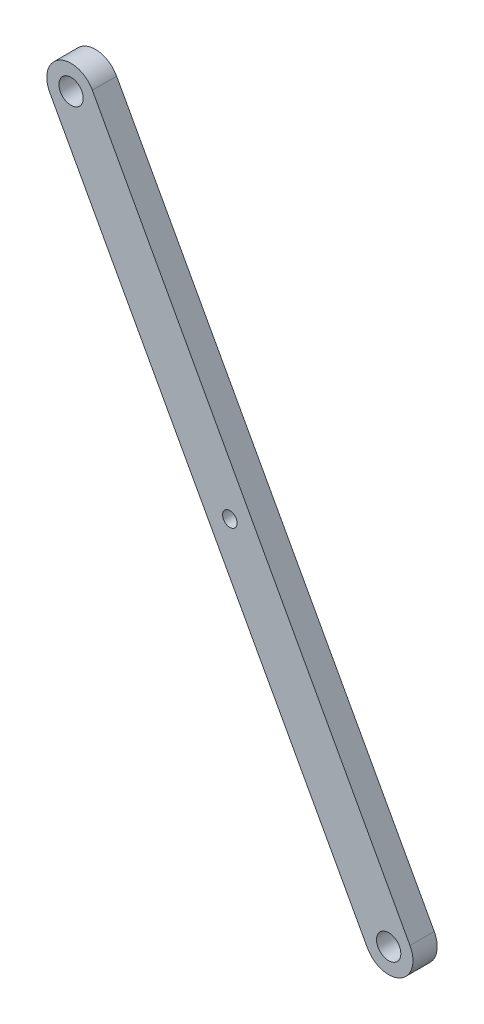
ISO-10303-21;
HEADER;
FILE_DESCRIPTION(('STEP AP214'),'2;1');
FILE_NAME('part.step','',(''),(''),'','','');
FILE_SCHEMA(('AUTOMOTIVE_DESIGN { 1 0 10303 214 1 1 1 1 }'));
ENDSEC;
DATA;
#1=APPLICATION_CONTEXT('core data for automotive mechanical design processes');
#2=APPLICATION_PROTOCOL_DEFINITION('international standard','automotive_design',2000,#1);
#3=PRODUCT_CONTEXT('',#1,'mechanical');
#4=PRODUCT('Part','Part','',(#3));
#5=PRODUCT_RELATED_PRODUCT_CATEGORY('part','',(#4));
#6=PRODUCT_DEFINITION_FORMATION('','',#4);
#7=PRODUCT_DEFINITION_CONTEXT('part definition',#1,'design');
#8=PRODUCT_DEFINITION('design','',#6,#7);
#9=PRODUCT_DEFINITION_SHAPE('','',#8);
#10=(LENGTH_UNIT() NAMED_UNIT(*) SI_UNIT(.MILLI.,.METRE.));
#11=(NAMED_UNIT(*) PLANE_ANGLE_UNIT() SI_UNIT($,.RADIAN.));
#12=(NAMED_UNIT(*) SI_UNIT($,.STERADIAN.) SOLID_ANGLE_UNIT());
#13=UNCERTAINTY_MEASURE_WITH_UNIT(LENGTH_MEASURE(1.E-05),#10,'distance_accuracy_value','');
#14=(GEOMETRIC_REPRESENTATION_CONTEXT(3) GLOBAL_UNCERTAINTY_ASSIGNED_CONTEXT((#13)) GLOBAL_UNIT_ASSIGNED_CONTEXT((#10,
#11,#12)) REPRESENTATION_CONTEXT('',''));
#15=CARTESIAN_POINT('',(0.,0.,0.));
#16=DIRECTION('',(0.,0.,1.));
#17=DIRECTION('',(1.,0.,0.));
#18=AXIS2_PLACEMENT_3D('',#15,#16,#17);
#19=CARTESIAN_POINT('',(97.5204498128423,-9.68307122254591,5.));
#20=DIRECTION('',(0.,0.,1.));
#21=DIRECTION('',(1.,0.,0.));
#22=AXIS2_PLACEMENT_3D('',#19,#20,#21);
#23=PLANE('',#22);
#24=CARTESIAN_POINT('',(130.231663428676,-69.6144676660209,5.));
#25=DIRECTION('',(0.,0.,1.));
#26=DIRECTION('',(1.,0.,0.));
#27=AXIS2_PLACEMENT_3D('',#24,#25,#26);
#28=CIRCLE('',#27,1.5);
#29=CARTESIAN_POINT('',(131.731663428676,-69.6144676660209,5.));
#30=VERTEX_POINT('',#29);
#31=EDGE_CURVE('E124',#30,#30,#28,.T.);
#32=ORIENTED_EDGE('',*,*,#31,.F.);
#33=EDGE_LOOP('',(#32));
#34=FACE_BOUND('',#33,.T.);
#35=CARTESIAN_POINT('',(97.5204498128423,-9.68307122254591,5.));
#36=DIRECTION('',(0.,0.,1.));
#37=DIRECTION('',(1.,0.,0.));
#38=AXIS2_PLACEMENT_3D('',#35,#36,#37);
#39=CIRCLE('',#38,2.50000000000001);
#40=CARTESIAN_POINT('',(100.020449812842,-9.68307122254591,5.));
#41=VERTEX_POINT('',#40);
#42=EDGE_CURVE('E100',#41,#41,#39,.T.);
#43=ORIENTED_EDGE('',*,*,#42,.F.);
#44=EDGE_LOOP('',(#43));
#45=FACE_BOUND('',#44,.T.);
#46=CARTESIAN_POINT('',(97.5204498128423,-9.68307122254591,5.));
#47=DIRECTION('',(0.,0.,1.));
#48=DIRECTION('',(1.,0.,0.));
#49=AXIS2_PLACEMENT_3D('',#46,#47,#48);
#50=CIRCLE('',#49,5.);
#51=CARTESIAN_POINT('',(101.909269915411,-7.28760506597173,5.));
#52=VERTEX_POINT('',#51);
#53=CARTESIAN_POINT('',(93.131629710274,-12.0785373791201,5.));
#54=VERTEX_POINT('',#53);
#55=EDGE_CURVE('E85',#52,#54,#50,.T.);
#56=ORIENTED_EDGE('',*,*,#55,.T.);
#57=DIRECTION('',(0.479093231314838,-0.877764020513661,0.));
#58=VECTOR('',#57,1.);
#59=CARTESIAN_POINT('',(93.131629710274,-12.0785373791201,5.));
#60=LINE('',#59,#58);
#61=CARTESIAN_POINT('',(158.55405694194,-131.94133026607,5.));
#62=VERTEX_POINT('',#61);
#63=EDGE_CURVE('E80',#54,#62,#60,.T.);
#64=ORIENTED_EDGE('',*,*,#63,.T.);
#65=CARTESIAN_POINT('',(162.942877044509,-129.545864109496,5.));
#66=DIRECTION('',(0.,0.,1.));
#67=DIRECTION('',(1.,0.,0.));
#68=AXIS2_PLACEMENT_3D('',#65,#66,#67);
#69=CIRCLE('',#68,4.99999999999996);
#70=CARTESIAN_POINT('',(167.331697147077,-127.150397952922,5.));
#71=VERTEX_POINT('',#70);
#72=EDGE_CURVE('E83',#62,#71,#69,.T.);
#73=ORIENTED_EDGE('',*,*,#72,.T.);
#74=DIRECTION('',(-0.479093231314838,0.877764020513661,0.));
#75=VECTOR('',#74,1.);
#76=CARTESIAN_POINT('',(101.909269915411,-7.28760506597173,5.));
#77=LINE('',#76,#75);
#78=EDGE_CURVE('E50',#71,#52,#77,.T.);
#79=ORIENTED_EDGE('',*,*,#78,.T.);
#80=EDGE_LOOP('',(#56,#64,#73,#79));
#81=FACE_BOUND('',#80,.T.);
#82=CARTESIAN_POINT('',(162.942877044509,-129.545864109496,5.));
#83=DIRECTION('',(0.,0.,1.));
#84=DIRECTION('',(1.,0.,0.));
#85=AXIS2_PLACEMENT_3D('',#82,#83,#84);
#86=CIRCLE('',#85,2.50000000000005);
#87=CARTESIAN_POINT('',(165.442877044509,-129.545864109496,5.));
#88=VERTEX_POINT('',#87);
#89=EDGE_CURVE('E115',#88,#88,#86,.T.);
#90=ORIENTED_EDGE('',*,*,#89,.F.);
#91=EDGE_LOOP('',(#90));
#92=FACE_BOUND('',#91,.T.);
#93=ADVANCED_FACE('F33',(#34,#45,#81,#92),#23,.T.);
#94=CARTESIAN_POINT('',(97.5204498128423,-9.68307122254591,0.));
#95=DIRECTION('',(0.,0.,1.));
#96=DIRECTION('',(1.,0.,0.));
#97=AXIS2_PLACEMENT_3D('',#94,#95,#96);
#98=PLANE('',#97);
#99=CARTESIAN_POINT('',(130.231663428676,-69.6144676660209,0.));
#100=DIRECTION('',(0.,0.,1.));
#101=DIRECTION('',(1.,0.,0.));
#102=AXIS2_PLACEMENT_3D('',#99,#100,#101);
#103=CIRCLE('',#102,1.5);
#104=CARTESIAN_POINT('',(131.731663428676,-69.6144676660209,0.));
#105=VERTEX_POINT('',#104);
#106=EDGE_CURVE('E121',#105,#105,#103,.T.);
#107=ORIENTED_EDGE('',*,*,#106,.T.);
#108=EDGE_LOOP('',(#107));
#109=FACE_BOUND('',#108,.T.);
#110=CARTESIAN_POINT('',(97.5204498128423,-9.68307122254591,0.));
#111=DIRECTION('',(0.,0.,1.));
#112=DIRECTION('',(1.,0.,0.));
#113=AXIS2_PLACEMENT_3D('',#110,#111,#112);
#114=CIRCLE('',#113,5.);
#115=CARTESIAN_POINT('',(101.909269915411,-7.28760506597173,0.));
#116=VERTEX_POINT('',#115);
#117=CARTESIAN_POINT('',(93.131629710274,-12.0785373791201,0.));
#118=VERTEX_POINT('',#117);
#119=EDGE_CURVE('E97',#116,#118,#114,.T.);
#120=ORIENTED_EDGE('',*,*,#119,.F.);
#121=DIRECTION('',(-0.479093231314838,0.877764020513661,0.));
#122=VECTOR('',#121,1.);
#123=CARTESIAN_POINT('',(101.909269915411,-7.28760506597173,0.));
#124=LINE('',#123,#122);
#125=CARTESIAN_POINT('',(167.331697147077,-127.150397952922,0.));
#126=VERTEX_POINT('',#125);
#127=EDGE_CURVE('E73',#126,#116,#124,.T.);
#128=ORIENTED_EDGE('',*,*,#127,.F.);
#129=CARTESIAN_POINT('',(162.942877044509,-129.545864109496,0.));
#130=DIRECTION('',(0.,0.,1.));
#131=DIRECTION('',(1.,0.,0.));
#132=AXIS2_PLACEMENT_3D('',#129,#130,#131);
#133=CIRCLE('',#132,4.99999999999996);
#134=CARTESIAN_POINT('',(158.55405694194,-131.94133026607,0.));
#135=VERTEX_POINT('',#134);
#136=EDGE_CURVE('E67',#135,#126,#133,.T.);
#137=ORIENTED_EDGE('',*,*,#136,.F.);
#138=DIRECTION('',(0.479093231314838,-0.877764020513661,0.));
#139=VECTOR('',#138,1.);
#140=CARTESIAN_POINT('',(93.131629710274,-12.0785373791201,0.));
#141=LINE('',#140,#139);
#142=EDGE_CURVE('E89',#118,#135,#141,.T.);
#143=ORIENTED_EDGE('',*,*,#142,.F.);
#144=EDGE_LOOP('',(#120,#128,#137,#143));
#145=FACE_BOUND('',#144,.T.);
#146=CARTESIAN_POINT('',(97.5204498128423,-9.68307122254591,0.));
#147=DIRECTION('',(0.,0.,1.));
#148=DIRECTION('',(1.,0.,0.));
#149=AXIS2_PLACEMENT_3D('',#146,#147,#148);
#150=CIRCLE('',#149,2.50000000000001);
#151=CARTESIAN_POINT('',(100.020449812842,-9.68307122254591,0.));
#152=VERTEX_POINT('',#151);
#153=EDGE_CURVE('E112',#152,#152,#150,.T.);
#154=ORIENTED_EDGE('',*,*,#153,.T.);
#155=EDGE_LOOP('',(#154));
#156=FACE_BOUND('',#155,.T.);
#157=CARTESIAN_POINT('',(162.942877044509,-129.545864109496,0.));
#158=DIRECTION('',(0.,0.,1.));
#159=DIRECTION('',(1.,0.,0.));
#160=AXIS2_PLACEMENT_3D('',#157,#158,#159);
#161=CIRCLE('',#160,2.50000000000005);
#162=CARTESIAN_POINT('',(165.442877044509,-129.545864109496,0.));
#163=VERTEX_POINT('',#162);
#164=EDGE_CURVE('E118',#163,#163,#161,.T.);
#165=ORIENTED_EDGE('',*,*,#164,.T.);
#166=EDGE_LOOP('',(#165));
#167=FACE_BOUND('',#166,.T.);
#168=ADVANCED_FACE('F108',(#109,#145,#156,#167),#98,.F.);
#169=CARTESIAN_POINT('',(97.5204498128423,-9.68307122254591,5.));
#170=DIRECTION('',(0.,0.,-1.));
#171=DIRECTION('',(-1.,0.,0.));
#172=AXIS2_PLACEMENT_3D('',#169,#170,#171);
#173=CYLINDRICAL_SURFACE('',#172,5.);
#174=ORIENTED_EDGE('',*,*,#119,.T.);
#175=DIRECTION('',(0.,0.,-1.));
#176=VECTOR('',#175,1.);
#177=CARTESIAN_POINT('',(93.131629710274,-12.0785373791201,5.));
#178=LINE('',#177,#176);
#179=EDGE_CURVE('E11',#54,#118,#178,.T.);
#180=ORIENTED_EDGE('',*,*,#179,.F.);
#181=ORIENTED_EDGE('',*,*,#55,.F.);
#182=DIRECTION('',(0.,0.,-1.));
#183=VECTOR('',#182,1.);
#184=CARTESIAN_POINT('',(101.909269915411,-7.28760506597173,5.));
#185=LINE('',#184,#183);
#186=EDGE_CURVE('E93',#52,#116,#185,.T.);
#187=ORIENTED_EDGE('',*,*,#186,.T.);
#188=EDGE_LOOP('',(#174,#180,#181,#187));
#189=FACE_BOUND('',#188,.T.);
#190=ADVANCED_FACE('F35',(#189),#173,.T.);
#191=CARTESIAN_POINT('',(93.131629710274,-12.0785373791201,5.));
#192=DIRECTION('',(0.877764020513661,0.479093231314838,0.));
#193=DIRECTION('',(-0.479093231314838,0.877764020513661,0.));
#194=AXIS2_PLACEMENT_3D('',#191,#192,#193);
#195=PLANE('',#194);
#196=ORIENTED_EDGE('',*,*,#142,.T.);
#197=DIRECTION('',(0.,0.,-1.));
#198=VECTOR('',#197,1.);
#199=CARTESIAN_POINT('',(158.55405694194,-131.94133026607,5.));
#200=LINE('',#199,#198);
#201=EDGE_CURVE('E42',#62,#135,#200,.T.);
#202=ORIENTED_EDGE('',*,*,#201,.F.);
#203=ORIENTED_EDGE('',*,*,#63,.F.);
#204=ORIENTED_EDGE('',*,*,#179,.T.);
#205=EDGE_LOOP('',(#196,#202,#203,#204));
#206=FACE_BOUND('',#205,.T.);
#207=ADVANCED_FACE('F88',(#206),#195,.F.);
#208=CARTESIAN_POINT('',(162.942877044509,-129.545864109496,5.));
#209=DIRECTION('',(0.,0.,-1.));
#210=DIRECTION('',(-1.,0.,0.));
#211=AXIS2_PLACEMENT_3D('',#208,#209,#210);
#212=CYLINDRICAL_SURFACE('',#211,4.99999999999996);
#213=ORIENTED_EDGE('',*,*,#136,.T.);
#214=DIRECTION('',(0.,0.,-1.));
#215=VECTOR('',#214,1.);
#216=CARTESIAN_POINT('',(167.331697147077,-127.150397952922,5.));
#217=LINE('',#216,#215);
#218=EDGE_CURVE('E90',#71,#126,#217,.T.);
#219=ORIENTED_EDGE('',*,*,#218,.F.);
#220=ORIENTED_EDGE('',*,*,#72,.F.);
#221=ORIENTED_EDGE('',*,*,#201,.T.);
#222=EDGE_LOOP('',(#213,#219,#220,#221));
#223=FACE_BOUND('',#222,.T.);
#224=ADVANCED_FACE('F91',(#223),#212,.T.);
#225=CARTESIAN_POINT('',(101.909269915411,-7.28760506597173,5.));
#226=DIRECTION('',(-0.877764020513661,-0.479093231314838,0.));
#227=DIRECTION('',(0.479093231314838,-0.877764020513661,0.));
#228=AXIS2_PLACEMENT_3D('',#225,#226,#227);
#229=PLANE('',#228);
#230=ORIENTED_EDGE('',*,*,#127,.T.);
#231=ORIENTED_EDGE('',*,*,#186,.F.);
#232=ORIENTED_EDGE('',*,*,#78,.F.);
#233=ORIENTED_EDGE('',*,*,#218,.T.);
#234=EDGE_LOOP('',(#230,#231,#232,#233));
#235=FACE_BOUND('',#234,.T.);
#236=ADVANCED_FACE('F105',(#235),#229,.F.);
#237=CARTESIAN_POINT('',(97.5204498128423,-9.68307122254591,5.));
#238=DIRECTION('',(0.,0.,-1.));
#239=DIRECTION('',(-1.,0.,0.));
#240=AXIS2_PLACEMENT_3D('',#237,#238,#239);
#241=CYLINDRICAL_SURFACE('',#240,2.50000000000001);
#242=ORIENTED_EDGE('',*,*,#42,.T.);
#243=EDGE_LOOP('',(#242));
#244=FACE_BOUND('',#243,.T.);
#245=ORIENTED_EDGE('',*,*,#153,.F.);
#246=EDGE_LOOP('',(#245));
#247=FACE_BOUND('',#246,.T.);
#248=ADVANCED_FACE('F143',(#244,#247),#241,.F.);
#249=CARTESIAN_POINT('',(162.942877044509,-129.545864109496,5.));
#250=DIRECTION('',(0.,0.,-1.));
#251=DIRECTION('',(-1.,0.,0.));
#252=AXIS2_PLACEMENT_3D('',#249,#250,#251);
#253=CYLINDRICAL_SURFACE('',#252,2.50000000000005);
#254=ORIENTED_EDGE('',*,*,#89,.T.);
#255=EDGE_LOOP('',(#254));
#256=FACE_BOUND('',#255,.T.);
#257=ORIENTED_EDGE('',*,*,#164,.F.);
#258=EDGE_LOOP('',(#257));
#259=FACE_BOUND('',#258,.T.);
#260=ADVANCED_FACE('F134',(#256,#259),#253,.F.);
#261=CARTESIAN_POINT('',(130.231663428676,-69.6144676660209,0.));
#262=DIRECTION('',(0.,0.,1.));
#263=DIRECTION('',(1.,0.,0.));
#264=AXIS2_PLACEMENT_3D('',#261,#262,#263);
#265=CYLINDRICAL_SURFACE('',#264,1.5);
#266=ORIENTED_EDGE('',*,*,#106,.F.);
#267=EDGE_LOOP('',(#266));
#268=FACE_BOUND('',#267,.T.);
#269=ORIENTED_EDGE('',*,*,#31,.T.);
#270=EDGE_LOOP('',(#269));
#271=FACE_BOUND('',#270,.T.);
#272=ADVANCED_FACE('F131',(#268,#271),#265,.F.);
#273=CLOSED_SHELL('',(#93,#168,#190,#207,#224,#236,#248,#260,#272));
#274=MANIFOLD_SOLID_BREP('B2',#273);
#275=ADVANCED_BREP_SHAPE_REPRESENTATION('',(#18,#274),#14);
#276=SHAPE_DEFINITION_REPRESENTATION(#9,#275);
ENDSEC;
END-ISO-10303-21;
